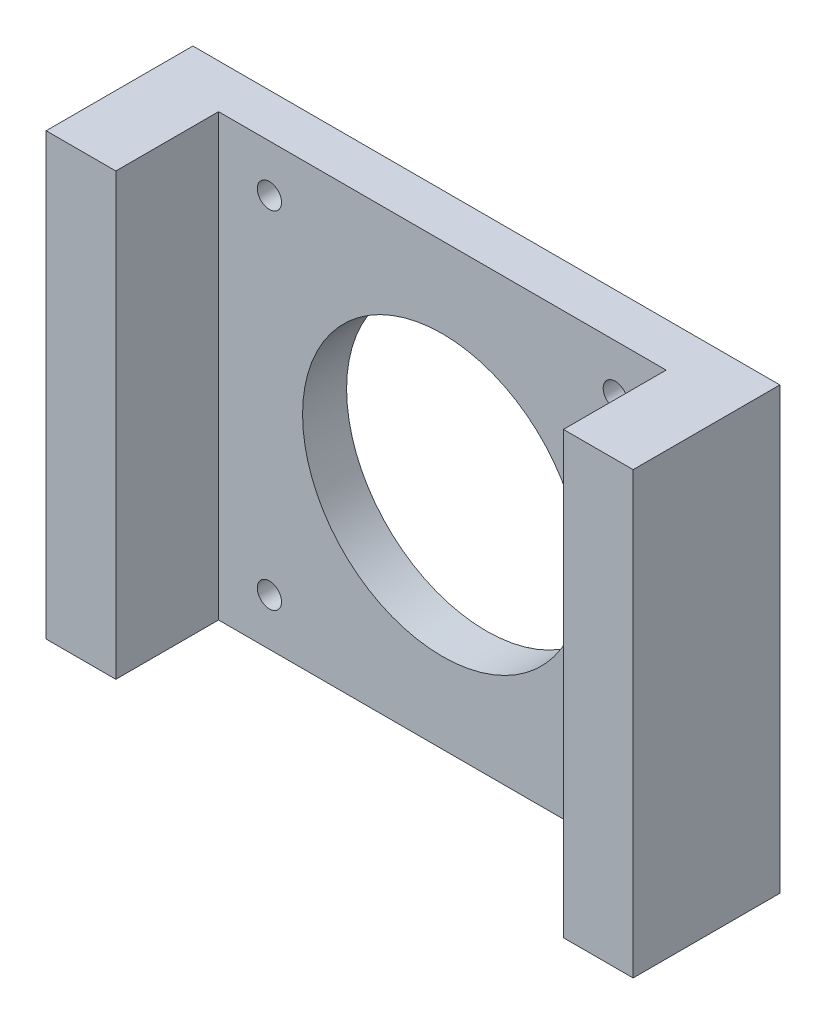
ISO-10303-21;
HEADER;
FILE_DESCRIPTION(('STEP AP214'),'2;1');
FILE_NAME('part.step','',(''),(''),'','','');
FILE_SCHEMA(('AUTOMOTIVE_DESIGN { 1 0 10303 214 1 1 1 1 }'));
ENDSEC;
DATA;
#1=APPLICATION_CONTEXT('core data for automotive mechanical design processes');
#2=APPLICATION_PROTOCOL_DEFINITION('international standard','automotive_design',2000,#1);
#3=PRODUCT_CONTEXT('',#1,'mechanical');
#4=PRODUCT('Part','Part','',(#3));
#5=PRODUCT_RELATED_PRODUCT_CATEGORY('part','',(#4));
#6=PRODUCT_DEFINITION_FORMATION('','',#4);
#7=PRODUCT_DEFINITION_CONTEXT('part definition',#1,'design');
#8=PRODUCT_DEFINITION('design','',#6,#7);
#9=PRODUCT_DEFINITION_SHAPE('','',#8);
#10=(LENGTH_UNIT() NAMED_UNIT(*) SI_UNIT(.MILLI.,.METRE.));
#11=(NAMED_UNIT(*) PLANE_ANGLE_UNIT() SI_UNIT($,.RADIAN.));
#12=(NAMED_UNIT(*) SI_UNIT($,.STERADIAN.) SOLID_ANGLE_UNIT());
#13=UNCERTAINTY_MEASURE_WITH_UNIT(LENGTH_MEASURE(1.E-05),#10,'distance_accuracy_value','');
#14=(GEOMETRIC_REPRESENTATION_CONTEXT(3) GLOBAL_UNCERTAINTY_ASSIGNED_CONTEXT((#13)) GLOBAL_UNIT_ASSIGNED_CONTEXT((#10,
#11,#12)) REPRESENTATION_CONTEXT('',''));
#15=CARTESIAN_POINT('',(0.,0.,0.));
#16=DIRECTION('',(0.,0.,1.));
#17=DIRECTION('',(1.,0.,0.));
#18=AXIS2_PLACEMENT_3D('',#15,#16,#17);
#19=CARTESIAN_POINT('',(0.,0.,20.));
#20=DIRECTION('',(0.,0.,-1.));
#21=DIRECTION('',(-1.,0.,0.));
#22=AXIS2_PLACEMENT_3D('',#19,#20,#21);
#23=PLANE('',#22);
#24=DIRECTION('',(1.,0.,0.));
#25=VECTOR('',#24,1.);
#26=CARTESIAN_POINT('',(-40.,-30.,20.));
#27=LINE('',#26,#25);
#28=CARTESIAN_POINT('',(-40.,-30.,20.));
#29=VERTEX_POINT('',#28);
#30=CARTESIAN_POINT('',(-30.5,-30.,20.));
#31=VERTEX_POINT('',#30);
#32=EDGE_CURVE('E146',#29,#31,#27,.T.);
#33=ORIENTED_EDGE('',*,*,#32,.T.);
#34=DIRECTION('',(0.,-1.,0.));
#35=VECTOR('',#34,1.);
#36=CARTESIAN_POINT('',(-30.5,-30.,20.));
#37=LINE('',#36,#35);
#38=CARTESIAN_POINT('',(-30.5,30.,20.));
#39=VERTEX_POINT('',#38);
#40=EDGE_CURVE('E128',#39,#31,#37,.T.);
#41=ORIENTED_EDGE('',*,*,#40,.F.);
#42=DIRECTION('',(-1.,0.,0.));
#43=VECTOR('',#42,1.);
#44=CARTESIAN_POINT('',(-40.,30.,20.));
#45=LINE('',#44,#43);
#46=CARTESIAN_POINT('',(-40.,30.,20.));
#47=VERTEX_POINT('',#46);
#48=EDGE_CURVE('E133',#39,#47,#45,.T.);
#49=ORIENTED_EDGE('',*,*,#48,.T.);
#50=DIRECTION('',(0.,-1.,0.));
#51=VECTOR('',#50,1.);
#52=CARTESIAN_POINT('',(-40.,-30.,20.));
#53=LINE('',#52,#51);
#54=EDGE_CURVE('E144',#47,#29,#53,.T.);
#55=ORIENTED_EDGE('',*,*,#54,.T.);
#56=EDGE_LOOP('',(#33,#41,#49,#55));
#57=FACE_BOUND('',#56,.T.);
#58=ADVANCED_FACE('F35',(#57),#23,.F.);
#59=CARTESIAN_POINT('',(40.,-30.,20.));
#60=DIRECTION('',(-1.,0.,0.));
#61=DIRECTION('',(0.,0.,1.));
#62=AXIS2_PLACEMENT_3D('',#59,#60,#61);
#63=PLANE('',#62);
#64=DIRECTION('',(0.,1.,0.));
#65=VECTOR('',#64,1.);
#66=CARTESIAN_POINT('',(40.,-30.,0.));
#67=LINE('',#66,#65);
#68=CARTESIAN_POINT('',(40.,-30.,0.));
#69=VERTEX_POINT('',#68);
#70=CARTESIAN_POINT('',(40.,30.,0.));
#71=VERTEX_POINT('',#70);
#72=EDGE_CURVE('E140',#69,#71,#67,.T.);
#73=ORIENTED_EDGE('',*,*,#72,.T.);
#74=DIRECTION('',(0.,0.,-1.));
#75=VECTOR('',#74,1.);
#76=CARTESIAN_POINT('',(40.,30.,20.));
#77=LINE('',#76,#75);
#78=CARTESIAN_POINT('',(40.,30.,20.));
#79=VERTEX_POINT('',#78);
#80=EDGE_CURVE('E12',#79,#71,#77,.T.);
#81=ORIENTED_EDGE('',*,*,#80,.F.);
#82=DIRECTION('',(0.,1.,0.));
#83=VECTOR('',#82,1.);
#84=CARTESIAN_POINT('',(40.,-30.,20.));
#85=LINE('',#84,#83);
#86=CARTESIAN_POINT('',(40.,-30.,20.));
#87=VERTEX_POINT('',#86);
#88=EDGE_CURVE('E141',#87,#79,#85,.T.);
#89=ORIENTED_EDGE('',*,*,#88,.F.);
#90=DIRECTION('',(0.,0.,-1.));
#91=VECTOR('',#90,1.);
#92=CARTESIAN_POINT('',(40.,-30.,20.));
#93=LINE('',#92,#91);
#94=EDGE_CURVE('E149',#87,#69,#93,.T.);
#95=ORIENTED_EDGE('',*,*,#94,.T.);
#96=EDGE_LOOP('',(#73,#81,#89,#95));
#97=FACE_BOUND('',#96,.T.);
#98=ADVANCED_FACE('F37',(#97),#63,.F.);
#99=CARTESIAN_POINT('',(-40.,30.,20.));
#100=DIRECTION('',(0.,-1.,0.));
#101=DIRECTION('',(0.,0.,-1.));
#102=AXIS2_PLACEMENT_3D('',#99,#100,#101);
#103=PLANE('',#102);
#104=ORIENTED_EDGE('',*,*,#48,.F.);
#105=DIRECTION('',(0.,0.,1.));
#106=VECTOR('',#105,1.);
#107=CARTESIAN_POINT('',(-30.5,30.,-85.5628424025289));
#108=LINE('',#107,#106);
#109=CARTESIAN_POINT('',(-30.5,30.,6.00000000000001));
#110=VERTEX_POINT('',#109);
#111=EDGE_CURVE('E115',#110,#39,#108,.T.);
#112=ORIENTED_EDGE('',*,*,#111,.F.);
#113=DIRECTION('',(-1.,0.,0.));
#114=VECTOR('',#113,1.);
#115=CARTESIAN_POINT('',(-30.5,30.,6.00000000000001));
#116=LINE('',#115,#114);
#117=CARTESIAN_POINT('',(30.5,30.,6.00000000000001));
#118=VERTEX_POINT('',#117);
#119=EDGE_CURVE('E124',#118,#110,#116,.T.);
#120=ORIENTED_EDGE('',*,*,#119,.F.);
#121=DIRECTION('',(0.,0.,1.));
#122=VECTOR('',#121,1.);
#123=CARTESIAN_POINT('',(30.5,30.,-85.5628424025289));
#124=LINE('',#123,#122);
#125=CARTESIAN_POINT('',(30.5,30.,20.));
#126=VERTEX_POINT('',#125);
#127=EDGE_CURVE('E138',#118,#126,#124,.T.);
#128=ORIENTED_EDGE('',*,*,#127,.T.);
#129=EDGE_CURVE('E89',#79,#126,#45,.T.);
#130=ORIENTED_EDGE('',*,*,#129,.F.);
#131=ORIENTED_EDGE('',*,*,#80,.T.);
#132=DIRECTION('',(-1.,0.,0.));
#133=VECTOR('',#132,1.);
#134=CARTESIAN_POINT('',(-40.,30.,0.));
#135=LINE('',#134,#133);
#136=CARTESIAN_POINT('',(-40.,30.,0.));
#137=VERTEX_POINT('',#136);
#138=EDGE_CURVE('E152',#71,#137,#135,.T.);
#139=ORIENTED_EDGE('',*,*,#138,.T.);
#140=DIRECTION('',(0.,0.,-1.));
#141=VECTOR('',#140,1.);
#142=CARTESIAN_POINT('',(-40.,30.,20.));
#143=LINE('',#142,#141);
#144=EDGE_CURVE('E44',#47,#137,#143,.T.);
#145=ORIENTED_EDGE('',*,*,#144,.F.);
#146=EDGE_LOOP('',(#104,#112,#120,#128,#130,#131,#139,#145));
#147=FACE_BOUND('',#146,.T.);
#148=ADVANCED_FACE('F131',(#147),#103,.F.);
#149=CARTESIAN_POINT('',(-40.,-30.,20.));
#150=DIRECTION('',(1.,0.,0.));
#151=DIRECTION('',(0.,0.,-1.));
#152=AXIS2_PLACEMENT_3D('',#149,#150,#151);
#153=PLANE('',#152);
#154=DIRECTION('',(0.,-1.,0.));
#155=VECTOR('',#154,1.);
#156=CARTESIAN_POINT('',(-40.,-30.,0.));
#157=LINE('',#156,#155);
#158=CARTESIAN_POINT('',(-40.,-30.,0.));
#159=VERTEX_POINT('',#158);
#160=EDGE_CURVE('E154',#137,#159,#157,.T.);
#161=ORIENTED_EDGE('',*,*,#160,.T.);
#162=DIRECTION('',(0.,0.,-1.));
#163=VECTOR('',#162,1.);
#164=CARTESIAN_POINT('',(-40.,-30.,20.));
#165=LINE('',#164,#163);
#166=EDGE_CURVE('E158',#29,#159,#165,.T.);
#167=ORIENTED_EDGE('',*,*,#166,.F.);
#168=ORIENTED_EDGE('',*,*,#54,.F.);
#169=ORIENTED_EDGE('',*,*,#144,.T.);
#170=EDGE_LOOP('',(#161,#167,#168,#169));
#171=FACE_BOUND('',#170,.T.);
#172=ADVANCED_FACE('F203',(#171),#153,.F.);
#173=CARTESIAN_POINT('',(-40.,-30.,20.));
#174=DIRECTION('',(0.,1.,0.));
#175=DIRECTION('',(0.,0.,1.));
#176=AXIS2_PLACEMENT_3D('',#173,#174,#175);
#177=PLANE('',#176);
#178=DIRECTION('',(1.,0.,0.));
#179=VECTOR('',#178,1.);
#180=CARTESIAN_POINT('',(-30.5,-30.,6.00000000000001));
#181=LINE('',#180,#179);
#182=CARTESIAN_POINT('',(-30.5,-30.,6.00000000000001));
#183=VERTEX_POINT('',#182);
#184=CARTESIAN_POINT('',(30.5,-30.,6.00000000000001));
#185=VERTEX_POINT('',#184);
#186=EDGE_CURVE('E196',#183,#185,#181,.T.);
#187=ORIENTED_EDGE('',*,*,#186,.F.);
#188=DIRECTION('',(0.,0.,1.));
#189=VECTOR('',#188,1.);
#190=CARTESIAN_POINT('',(-30.5,-30.,-85.5628424025289));
#191=LINE('',#190,#189);
#192=EDGE_CURVE('E118',#183,#31,#191,.T.);
#193=ORIENTED_EDGE('',*,*,#192,.T.);
#194=ORIENTED_EDGE('',*,*,#32,.F.);
#195=ORIENTED_EDGE('',*,*,#166,.T.);
#196=DIRECTION('',(1.,0.,0.));
#197=VECTOR('',#196,1.);
#198=CARTESIAN_POINT('',(-40.,-30.,0.));
#199=LINE('',#198,#197);
#200=EDGE_CURVE('E82',#159,#69,#199,.T.);
#201=ORIENTED_EDGE('',*,*,#200,.T.);
#202=ORIENTED_EDGE('',*,*,#94,.F.);
#203=CARTESIAN_POINT('',(30.5,-30.,20.));
#204=VERTEX_POINT('',#203);
#205=EDGE_CURVE('E60',#204,#87,#27,.T.);
#206=ORIENTED_EDGE('',*,*,#205,.F.);
#207=DIRECTION('',(0.,0.,1.));
#208=VECTOR('',#207,1.);
#209=CARTESIAN_POINT('',(30.5,-30.,-85.5628424025289));
#210=LINE('',#209,#208);
#211=EDGE_CURVE('E52',#185,#204,#210,.T.);
#212=ORIENTED_EDGE('',*,*,#211,.F.);
#213=EDGE_LOOP('',(#187,#193,#194,#195,#201,#202,#206,#212));
#214=FACE_BOUND('',#213,.T.);
#215=ADVANCED_FACE('F198',(#214),#177,.F.);
#216=ORIENTED_EDGE('',*,*,#129,.T.);
#217=DIRECTION('',(0.,1.,0.));
#218=VECTOR('',#217,1.);
#219=CARTESIAN_POINT('',(30.5,-30.,20.));
#220=LINE('',#219,#218);
#221=EDGE_CURVE('E165',#204,#126,#220,.T.);
#222=ORIENTED_EDGE('',*,*,#221,.F.);
#223=ORIENTED_EDGE('',*,*,#205,.T.);
#224=ORIENTED_EDGE('',*,*,#88,.T.);
#225=EDGE_LOOP('',(#216,#222,#223,#224));
#226=FACE_BOUND('',#225,.T.);
#227=ADVANCED_FACE('F211',(#226),#23,.F.);
#228=CARTESIAN_POINT('',(0.,0.,0.));
#229=DIRECTION('',(0.,0.,-1.));
#230=DIRECTION('',(-1.,0.,0.));
#231=AXIS2_PLACEMENT_3D('',#228,#229,#230);
#232=PLANE('',#231);
#233=CARTESIAN_POINT('',(-23.57,23.57,0.));
#234=DIRECTION('',(0.,0.,-1.));
#235=DIRECTION('',(-1.,0.,0.));
#236=AXIS2_PLACEMENT_3D('',#233,#234,#235);
#237=CIRCLE('',#236,1.64999999999999);
#238=CARTESIAN_POINT('',(-25.22,23.57,0.));
#239=VERTEX_POINT('',#238);
#240=EDGE_CURVE('E183',#239,#239,#237,.T.);
#241=ORIENTED_EDGE('',*,*,#240,.F.);
#242=EDGE_LOOP('',(#241));
#243=FACE_BOUND('',#242,.T.);
#244=CARTESIAN_POINT('',(23.57,-23.57,0.));
#245=DIRECTION('',(0.,0.,-1.));
#246=DIRECTION('',(-1.,0.,0.));
#247=AXIS2_PLACEMENT_3D('',#244,#245,#246);
#248=CIRCLE('',#247,1.64999999999999);
#249=CARTESIAN_POINT('',(21.92,-23.57,0.));
#250=VERTEX_POINT('',#249);
#251=EDGE_CURVE('E173',#250,#250,#248,.T.);
#252=ORIENTED_EDGE('',*,*,#251,.F.);
#253=EDGE_LOOP('',(#252));
#254=FACE_BOUND('',#253,.T.);
#255=CARTESIAN_POINT('',(23.57,23.57,0.));
#256=DIRECTION('',(0.,0.,-1.));
#257=DIRECTION('',(-1.,0.,0.));
#258=AXIS2_PLACEMENT_3D('',#255,#256,#257);
#259=CIRCLE('',#258,1.64999999999999);
#260=CARTESIAN_POINT('',(21.92,23.57,0.));
#261=VERTEX_POINT('',#260);
#262=EDGE_CURVE('E170',#261,#261,#259,.T.);
#263=ORIENTED_EDGE('',*,*,#262,.F.);
#264=EDGE_LOOP('',(#263));
#265=FACE_BOUND('',#264,.T.);
#266=CARTESIAN_POINT('',(-23.57,-23.57,0.));
#267=DIRECTION('',(0.,0.,-1.));
#268=DIRECTION('',(-1.,0.,0.));
#269=AXIS2_PLACEMENT_3D('',#266,#267,#268);
#270=CIRCLE('',#269,1.64999999999999);
#271=CARTESIAN_POINT('',(-25.22,-23.57,0.));
#272=VERTEX_POINT('',#271);
#273=EDGE_CURVE('E169',#272,#272,#270,.T.);
#274=ORIENTED_EDGE('',*,*,#273,.F.);
#275=EDGE_LOOP('',(#274));
#276=FACE_BOUND('',#275,.T.);
#277=CARTESIAN_POINT('',(0.,0.,0.));
#278=DIRECTION('',(0.,0.,-1.));
#279=DIRECTION('',(-1.,0.,0.));
#280=AXIS2_PLACEMENT_3D('',#277,#278,#279);
#281=CIRCLE('',#280,19.05);
#282=CARTESIAN_POINT('',(-19.05,0.,0.));
#283=VERTEX_POINT('',#282);
#284=EDGE_CURVE('E166',#283,#283,#281,.T.);
#285=ORIENTED_EDGE('',*,*,#284,.F.);
#286=EDGE_LOOP('',(#285));
#287=FACE_BOUND('',#286,.T.);
#288=ORIENTED_EDGE('',*,*,#72,.F.);
#289=ORIENTED_EDGE('',*,*,#200,.F.);
#290=ORIENTED_EDGE('',*,*,#160,.F.);
#291=ORIENTED_EDGE('',*,*,#138,.F.);
#292=EDGE_LOOP('',(#288,#289,#290,#291));
#293=FACE_BOUND('',#292,.T.);
#294=ADVANCED_FACE('F207',(#243,#254,#265,#276,#287,#293),#232,.T.);
#295=CARTESIAN_POINT('',(0.,0.,6.));
#296=DIRECTION('',(0.,0.,-1.));
#297=DIRECTION('',(-1.,0.,0.));
#298=AXIS2_PLACEMENT_3D('',#295,#296,#297);
#299=PLANE('',#298);
#300=CARTESIAN_POINT('',(-23.57,23.57,6.));
#301=DIRECTION('',(0.,0.,-1.));
#302=DIRECTION('',(-1.,0.,0.));
#303=AXIS2_PLACEMENT_3D('',#300,#301,#302);
#304=CIRCLE('',#303,1.64999999999999);
#305=CARTESIAN_POINT('',(-25.22,23.57,6.));
#306=VERTEX_POINT('',#305);
#307=EDGE_CURVE('E39',#306,#306,#304,.T.);
#308=ORIENTED_EDGE('',*,*,#307,.T.);
#309=EDGE_LOOP('',(#308));
#310=FACE_BOUND('',#309,.T.);
#311=CARTESIAN_POINT('',(23.57,-23.57,6.));
#312=DIRECTION('',(0.,0.,-1.));
#313=DIRECTION('',(-1.,0.,0.));
#314=AXIS2_PLACEMENT_3D('',#311,#312,#313);
#315=CIRCLE('',#314,1.64999999999999);
#316=CARTESIAN_POINT('',(21.92,-23.57,6.));
#317=VERTEX_POINT('',#316);
#318=EDGE_CURVE('E171',#317,#317,#315,.T.);
#319=ORIENTED_EDGE('',*,*,#318,.T.);
#320=EDGE_LOOP('',(#319));
#321=FACE_BOUND('',#320,.T.);
#322=CARTESIAN_POINT('',(23.57,23.57,6.));
#323=DIRECTION('',(0.,0.,-1.));
#324=DIRECTION('',(-1.,0.,0.));
#325=AXIS2_PLACEMENT_3D('',#322,#323,#324);
#326=CIRCLE('',#325,1.64999999999999);
#327=CARTESIAN_POINT('',(21.92,23.57,6.));
#328=VERTEX_POINT('',#327);
#329=EDGE_CURVE('E167',#328,#328,#326,.T.);
#330=ORIENTED_EDGE('',*,*,#329,.T.);
#331=EDGE_LOOP('',(#330));
#332=FACE_BOUND('',#331,.T.);
#333=CARTESIAN_POINT('',(-23.57,-23.57,6.));
#334=DIRECTION('',(0.,0.,-1.));
#335=DIRECTION('',(-1.,0.,0.));
#336=AXIS2_PLACEMENT_3D('',#333,#334,#335);
#337=CIRCLE('',#336,1.64999999999999);
#338=CARTESIAN_POINT('',(-25.22,-23.57,6.));
#339=VERTEX_POINT('',#338);
#340=EDGE_CURVE('E188',#339,#339,#337,.T.);
#341=ORIENTED_EDGE('',*,*,#340,.T.);
#342=EDGE_LOOP('',(#341));
#343=FACE_BOUND('',#342,.T.);
#344=CARTESIAN_POINT('',(0.,0.,6.));
#345=DIRECTION('',(0.,0.,-1.));
#346=DIRECTION('',(-1.,0.,0.));
#347=AXIS2_PLACEMENT_3D('',#344,#345,#346);
#348=CIRCLE('',#347,19.05);
#349=CARTESIAN_POINT('',(-19.05,0.,6.));
#350=VERTEX_POINT('',#349);
#351=EDGE_CURVE('E162',#350,#350,#348,.T.);
#352=ORIENTED_EDGE('',*,*,#351,.T.);
#353=EDGE_LOOP('',(#352));
#354=FACE_BOUND('',#353,.T.);
#355=DIRECTION('',(0.,1.,0.));
#356=VECTOR('',#355,1.);
#357=CARTESIAN_POINT('',(30.5,-30.,6.00000000000001));
#358=LINE('',#357,#356);
#359=EDGE_CURVE('E126',#185,#118,#358,.T.);
#360=ORIENTED_EDGE('',*,*,#359,.T.);
#361=ORIENTED_EDGE('',*,*,#119,.T.);
#362=DIRECTION('',(0.,-1.,0.));
#363=VECTOR('',#362,1.);
#364=CARTESIAN_POINT('',(-30.5,-30.,6.00000000000001));
#365=LINE('',#364,#363);
#366=EDGE_CURVE('E111',#110,#183,#365,.T.);
#367=ORIENTED_EDGE('',*,*,#366,.T.);
#368=ORIENTED_EDGE('',*,*,#186,.T.);
#369=EDGE_LOOP('',(#360,#361,#367,#368));
#370=FACE_BOUND('',#369,.T.);
#371=ADVANCED_FACE('F125',(#310,#321,#332,#343,#354,#370),#299,.F.);
#372=CARTESIAN_POINT('',(-30.5,-30.,-85.5628424025289));
#373=DIRECTION('',(-1.,0.,0.));
#374=DIRECTION('',(0.,0.,1.));
#375=AXIS2_PLACEMENT_3D('',#372,#373,#374);
#376=PLANE('',#375);
#377=ORIENTED_EDGE('',*,*,#111,.T.);
#378=ORIENTED_EDGE('',*,*,#40,.T.);
#379=ORIENTED_EDGE('',*,*,#192,.F.);
#380=ORIENTED_EDGE('',*,*,#366,.F.);
#381=EDGE_LOOP('',(#377,#378,#379,#380));
#382=FACE_BOUND('',#381,.T.);
#383=ADVANCED_FACE('F113',(#382),#376,.F.);
#384=CARTESIAN_POINT('',(30.5,-30.,-85.5628424025289));
#385=DIRECTION('',(1.,0.,0.));
#386=DIRECTION('',(0.,0.,-1.));
#387=AXIS2_PLACEMENT_3D('',#384,#385,#386);
#388=PLANE('',#387);
#389=ORIENTED_EDGE('',*,*,#211,.T.);
#390=ORIENTED_EDGE('',*,*,#221,.T.);
#391=ORIENTED_EDGE('',*,*,#127,.F.);
#392=ORIENTED_EDGE('',*,*,#359,.F.);
#393=EDGE_LOOP('',(#389,#390,#391,#392));
#394=FACE_BOUND('',#393,.T.);
#395=ADVANCED_FACE('F212',(#394),#388,.F.);
#396=CARTESIAN_POINT('',(0.,0.,20.));
#397=DIRECTION('',(0.,0.,-1.));
#398=DIRECTION('',(-1.,0.,0.));
#399=AXIS2_PLACEMENT_3D('',#396,#397,#398);
#400=CYLINDRICAL_SURFACE('',#399,19.05);
#401=ORIENTED_EDGE('',*,*,#284,.T.);
#402=EDGE_LOOP('',(#401));
#403=FACE_BOUND('',#402,.T.);
#404=ORIENTED_EDGE('',*,*,#351,.F.);
#405=EDGE_LOOP('',(#404));
#406=FACE_BOUND('',#405,.T.);
#407=ADVANCED_FACE('F214',(#403,#406),#400,.F.);
#408=CARTESIAN_POINT('',(-23.57,-23.57,0.));
#409=DIRECTION('',(0.,0.,-1.));
#410=DIRECTION('',(-1.,0.,0.));
#411=AXIS2_PLACEMENT_3D('',#408,#409,#410);
#412=CYLINDRICAL_SURFACE('',#411,1.64999999999999);
#413=ORIENTED_EDGE('',*,*,#273,.T.);
#414=EDGE_LOOP('',(#413));
#415=FACE_BOUND('',#414,.T.);
#416=ORIENTED_EDGE('',*,*,#340,.F.);
#417=EDGE_LOOP('',(#416));
#418=FACE_BOUND('',#417,.T.);
#419=ADVANCED_FACE('F220',(#415,#418),#412,.F.);
#420=CARTESIAN_POINT('',(23.57,23.57,0.));
#421=DIRECTION('',(0.,0.,-1.));
#422=DIRECTION('',(-1.,0.,0.));
#423=AXIS2_PLACEMENT_3D('',#420,#421,#422);
#424=CYLINDRICAL_SURFACE('',#423,1.64999999999999);
#425=ORIENTED_EDGE('',*,*,#262,.T.);
#426=EDGE_LOOP('',(#425));
#427=FACE_BOUND('',#426,.T.);
#428=ORIENTED_EDGE('',*,*,#329,.F.);
#429=EDGE_LOOP('',(#428));
#430=FACE_BOUND('',#429,.T.);
#431=ADVANCED_FACE('F294',(#427,#430),#424,.F.);
#432=CARTESIAN_POINT('',(23.57,-23.57,0.));
#433=DIRECTION('',(0.,0.,-1.));
#434=DIRECTION('',(-1.,0.,0.));
#435=AXIS2_PLACEMENT_3D('',#432,#433,#434);
#436=CYLINDRICAL_SURFACE('',#435,1.64999999999999);
#437=ORIENTED_EDGE('',*,*,#251,.T.);
#438=EDGE_LOOP('',(#437));
#439=FACE_BOUND('',#438,.T.);
#440=ORIENTED_EDGE('',*,*,#318,.F.);
#441=EDGE_LOOP('',(#440));
#442=FACE_BOUND('',#441,.T.);
#443=ADVANCED_FACE('F303',(#439,#442),#436,.F.);
#444=CARTESIAN_POINT('',(-23.57,23.57,0.));
#445=DIRECTION('',(0.,0.,-1.));
#446=DIRECTION('',(-1.,0.,0.));
#447=AXIS2_PLACEMENT_3D('',#444,#445,#446);
#448=CYLINDRICAL_SURFACE('',#447,1.64999999999999);
#449=ORIENTED_EDGE('',*,*,#240,.T.);
#450=EDGE_LOOP('',(#449));
#451=FACE_BOUND('',#450,.T.);
#452=ORIENTED_EDGE('',*,*,#307,.F.);
#453=EDGE_LOOP('',(#452));
#454=FACE_BOUND('',#453,.T.);
#455=ADVANCED_FACE('F312',(#451,#454),#448,.F.);
#456=CLOSED_SHELL('',(#58,#98,#148,#172,#215,#227,#294,#371,#383,#395,#407,#419,#431,#443,#455));
#457=MANIFOLD_SOLID_BREP('B2',#456);
#458=ADVANCED_BREP_SHAPE_REPRESENTATION('',(#18,#457),#14);
#459=SHAPE_DEFINITION_REPRESENTATION(#9,#458);
ENDSEC;
END-ISO-10303-21;
